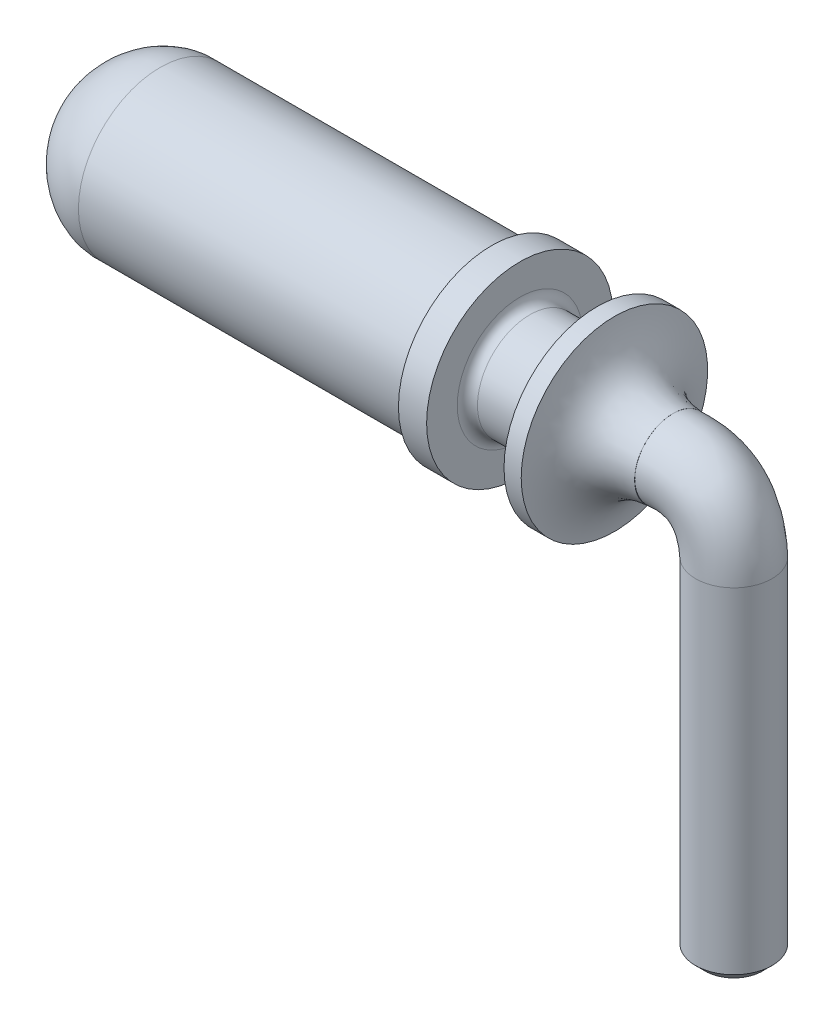
ISO-10303-21;
HEADER;
FILE_DESCRIPTION(('STEP AP214'),'2;1');
FILE_NAME('part.step','',(''),(''),'','','');
FILE_SCHEMA(('AUTOMOTIVE_DESIGN { 1 0 10303 214 1 1 1 1 }'));
ENDSEC;
DATA;
#1=APPLICATION_CONTEXT('core data for automotive mechanical design processes');
#2=APPLICATION_PROTOCOL_DEFINITION('international standard','automotive_design',2000,#1);
#3=PRODUCT_CONTEXT('',#1,'mechanical');
#4=PRODUCT('Part','Part','',(#3));
#5=PRODUCT_RELATED_PRODUCT_CATEGORY('part','',(#4));
#6=PRODUCT_DEFINITION_FORMATION('','',#4);
#7=PRODUCT_DEFINITION_CONTEXT('part definition',#1,'design');
#8=PRODUCT_DEFINITION('design','',#6,#7);
#9=PRODUCT_DEFINITION_SHAPE('','',#8);
#10=(LENGTH_UNIT() NAMED_UNIT(*) SI_UNIT(.MILLI.,.METRE.));
#11=(NAMED_UNIT(*) PLANE_ANGLE_UNIT() SI_UNIT($,.RADIAN.));
#12=(NAMED_UNIT(*) SI_UNIT($,.STERADIAN.) SOLID_ANGLE_UNIT());
#13=UNCERTAINTY_MEASURE_WITH_UNIT(LENGTH_MEASURE(1.E-05),#10,'distance_accuracy_value','');
#14=(GEOMETRIC_REPRESENTATION_CONTEXT(3) GLOBAL_UNCERTAINTY_ASSIGNED_CONTEXT((#13)) GLOBAL_UNIT_ASSIGNED_CONTEXT((#10,
#11,#12)) REPRESENTATION_CONTEXT('',''));
#15=CARTESIAN_POINT('',(0.,0.,0.));
#16=DIRECTION('',(0.,0.,1.));
#17=DIRECTION('',(1.,0.,0.));
#18=AXIS2_PLACEMENT_3D('',#15,#16,#17);
#19=CARTESIAN_POINT('',(2.86119939530297,6.27299782225298,0.));
#20=CARTESIAN_POINT('',(2.21093282068954,6.32097911556599,0.));
#21=CARTESIAN_POINT('',(1.56884413774031,5.64746855811936,0.));
#22=CARTESIAN_POINT('',(1.6260955307852,4.98680180097318,0.));
#23=B_SPLINE_CURVE_WITH_KNOTS('',3,(#19,#20,#21,#22),.UNSPECIFIED.,.F.,.F.,(4,4),(0.,1.),.UNSPECIFIED.);
#24=CARTESIAN_POINT('',(1.6260955307852,4.98680180097318,0.));
#25=DIRECTION('',(-1.,0.,0.));
#26=AXIS1_PLACEMENT('',#24,#25);
#27=SURFACE_OF_REVOLUTION('',#23,#26);
#28=CARTESIAN_POINT('',(1.6260955307852,4.98680180097318,0.));
#29=VERTEX_POINT('',#28);
#30=VERTEX_LOOP('',#29);
#31=FACE_BOUND('',#30,.T.);
#32=CARTESIAN_POINT('',(2.86119939530297,4.98680180097318,0.));
#33=DIRECTION('',(-1.,0.,0.));
#34=DIRECTION('',(0.,0.,1.));
#35=AXIS2_PLACEMENT_3D('',#32,#33,#34);
#36=CIRCLE('',#35,1.2861960212798);
#37=CARTESIAN_POINT('',(2.86119939530297,4.98680180097318,1.2861960212798));
#38=VERTEX_POINT('',#37);
#39=EDGE_CURVE('E68',#38,#38,#36,.T.);
#40=ORIENTED_EDGE('',*,*,#39,.T.);
#41=EDGE_LOOP('',(#40));
#42=FACE_BOUND('',#41,.T.);
#43=ADVANCED_FACE('F35',(#31,#42),#27,.T.);
#44=CARTESIAN_POINT('',(10.9215359798611,4.98680180097318,0.));
#45=DIRECTION('',(-1.,0.,0.));
#46=DIRECTION('',(0.,0.,1.));
#47=AXIS2_PLACEMENT_3D('',#44,#45,#46);
#48=PLANE('',#47);
#49=CARTESIAN_POINT('',(10.9215359798611,4.98680180097318,-0.599999999999998));
#50=CARTESIAN_POINT('',(10.9215359798611,5.00631371218067,-0.600000905869509));
#51=CARTESIAN_POINT('',(10.9215359798611,5.02581653306096,-0.599051764193004));
#52=CARTESIAN_POINT('',(10.9215359798611,5.06467222482705,-0.595265325416979));
#53=CARTESIAN_POINT('',(10.9215359798611,5.0840247762994,-0.592424750528807));
#54=CARTESIAN_POINT('',(10.9215359798611,5.13636618451657,-0.582111519608839));
#55=CARTESIAN_POINT('',(10.9215359798611,5.1690060027675,-0.572771501023492));
#56=CARTESIAN_POINT('',(10.9215359798611,5.23226235983946,-0.548738850973711));
#57=CARTESIAN_POINT('',(10.9215359798611,5.26287746167061,-0.534042465125776));
#58=CARTESIAN_POINT('',(10.9215359798611,5.32118497669962,-0.49972151329402));
#59=CARTESIAN_POINT('',(10.9215359798611,5.34887933441963,-0.48010025589777));
#60=CARTESIAN_POINT('',(10.9215359798611,5.40057342304137,-0.436479640056266));
#61=CARTESIAN_POINT('',(10.9215359798611,5.42457311448244,-0.41248023485645));
#62=CARTESIAN_POINT('',(10.9215359798611,5.46815652028505,-0.360826938809497));
#63=CARTESIAN_POINT('',(10.9215359798611,5.48774733552331,-0.333179039798175));
#64=CARTESIAN_POINT('',(10.9215359798611,5.52200251702507,-0.274983661465857));
#65=CARTESIAN_POINT('',(10.9215359798611,5.53666694358756,-0.244436217641155));
#66=CARTESIAN_POINT('',(10.9215359798611,5.56063586439295,-0.181348133850697));
#67=CARTESIAN_POINT('',(10.9215359798611,5.56994673516577,-0.148809916409271));
#68=CARTESIAN_POINT('',(10.9215359798611,5.58296982055429,-0.0826313042567923));
#69=CARTESIAN_POINT('',(10.9215359798611,5.58668198471284,-0.0489908996153061));
#70=CARTESIAN_POINT('',(10.9215359798611,5.58840085854777,0.0184137341530029));
#71=CARTESIAN_POINT('',(10.9215359798611,5.58641121572194,0.0521778703254224));
#72=CARTESIAN_POINT('',(10.9215359798611,5.57679122882931,0.118892107442368));
#73=CARTESIAN_POINT('',(10.9215359798611,5.56916099235123,0.151842223901121));
#74=CARTESIAN_POINT('',(10.9215359798611,5.54847839155734,0.21599163772166));
#75=CARTESIAN_POINT('',(10.9215359798611,5.53542641694818,0.247191060737829));
#76=CARTESIAN_POINT('',(10.9215359798611,5.5042719061192,0.30695829594544));
#77=CARTESIAN_POINT('',(10.9215359798611,5.48616921119512,0.335526025406006));
#78=CARTESIAN_POINT('',(10.9215359798611,5.44541885430269,0.38923390995087));
#79=CARTESIAN_POINT('',(10.9215359798611,5.42276892234223,0.414372342552922));
#80=CARTESIAN_POINT('',(10.9215359798611,5.37357371648668,0.460494581963287));
#81=CARTESIAN_POINT('',(10.9215359798611,5.34702845594151,0.481478403009545));
#82=CARTESIAN_POINT('',(10.9215359798611,5.29076477418325,0.518723333364575));
#83=CARTESIAN_POINT('',(10.9215359798611,5.26104249246329,0.534978605556111));
#84=CARTESIAN_POINT('',(10.9215359798611,5.19929416118594,0.562273330219152));
#85=CARTESIAN_POINT('',(10.9215359798611,5.16726881648412,0.57331437075122));
#86=CARTESIAN_POINT('',(10.9215359798611,5.11042203115056,0.587704533384412));
#87=CARTESIAN_POINT('',(10.9215359798611,5.08591074422,0.592310883306045));
#88=CARTESIAN_POINT('',(10.9215359798611,5.03653659897539,0.598459729874815));
#89=CARTESIAN_POINT('',(10.9215359798611,5.01167419336,0.600005863141146));
#90=CARTESIAN_POINT('',(10.9215359798611,4.98680180097318,0.599999999999998));
#91=B_SPLINE_CURVE_WITH_KNOTS('',3,(#49,#50,#51,#52,#53,#54,#55,#56,#57,#58,#59,#60,#61,#62,#63,
#64,#65,#66,#67,#68,#69,#70,#71,#72,#73,#74,#75,#76,#77,#78,#79,#80,#81,#82,#83,#84,#85,#86,#87,
#88,#89,#90),.UNSPECIFIED.,.F.,.F.,(4,2,2,2,2,2,2,2,2,2,2,2,2,2,2,2,2,2,2,2,4),(0.,
0.0584946893065879,0.117091012638487,0.218424807154772,0.319829765552225,0.42116678037985,
0.52250487745626,0.623678573717659,0.72485103156805,0.825902733642615,0.926955346418444,
1.02794332935205,1.12892938609006,1.22990818535276,1.33089015793924,1.43192266689122,
1.53295482959655,1.63411118642889,1.73523671490604,1.80987549999495,1.88442553444043),.UNSPECIFIED.);
#92=CARTESIAN_POINT('',(10.9215359798611,4.98680180097318,-0.599999999999998));
#93=VERTEX_POINT('',#92);
#94=CARTESIAN_POINT('',(10.9215359798611,4.98680180097318,0.599999999999998));
#95=VERTEX_POINT('',#94);
#96=EDGE_CURVE('E49',#93,#95,#91,.T.);
#97=ORIENTED_EDGE('',*,*,#96,.F.);
#98=DIRECTION('',(0.,0.,1.));
#99=VECTOR('',#98,1.);
#100=CARTESIAN_POINT('',(10.9215359798611,4.98680180097318,0.));
#101=LINE('',#100,#99);
#102=EDGE_CURVE('E55',#93,#95,#101,.T.);
#103=ORIENTED_EDGE('',*,*,#102,.T.);
#104=EDGE_LOOP('',(#97,#103));
#105=FACE_BOUND('',#104,.T.);
#106=CARTESIAN_POINT('',(10.9215359798611,4.98680180097318,0.));
#107=DIRECTION('',(-1.,0.,0.));
#108=DIRECTION('',(0.,0.,1.));
#109=AXIS2_PLACEMENT_3D('',#106,#107,#108);
#110=CIRCLE('',#109,0.602034634420137);
#111=CARTESIAN_POINT('',(10.9215359798611,4.98680180097318,0.602034634420137));
#112=VERTEX_POINT('',#111);
#113=EDGE_CURVE('E65',#112,#112,#110,.T.);
#114=ORIENTED_EDGE('',*,*,#113,.F.);
#115=EDGE_LOOP('',(#114));
#116=FACE_BOUND('',#115,.T.);
#117=ADVANCED_FACE('F56',(#105,#116),#48,.F.);
#118=CARTESIAN_POINT('',(10.9215359798611,5.58883643539332,0.));
#119=CARTESIAN_POINT('',(10.1135709093461,5.6374308046932,0.));
#120=CARTESIAN_POINT('',(10.0024188102123,6.45263104893288,0.));
#121=B_SPLINE_CURVE_WITH_KNOTS('',2,(#118,#119,#120),.UNSPECIFIED.,.F.,.F.,(3,3),(0.,1.),.UNSPECIFIED.);
#122=CARTESIAN_POINT('',(1.6260955307852,4.98680180097318,0.));
#123=DIRECTION('',(-1.,0.,0.));
#124=AXIS1_PLACEMENT('',#122,#123);
#125=SURFACE_OF_REVOLUTION('',#121,#124);
#126=CARTESIAN_POINT('',(10.0024188102123,4.98680180097318,0.));
#127=DIRECTION('',(-1.,0.,0.));
#128=DIRECTION('',(0.,0.,1.));
#129=AXIS2_PLACEMENT_3D('',#126,#127,#128);
#130=CIRCLE('',#129,1.4658292479597);
#131=CARTESIAN_POINT('',(10.0024188102123,4.98680180097318,1.4658292479597));
#132=VERTEX_POINT('',#131);
#133=EDGE_CURVE('E160',#132,#132,#130,.T.);
#134=ORIENTED_EDGE('',*,*,#133,.F.);
#135=EDGE_LOOP('',(#134));
#136=FACE_BOUND('',#135,.T.);
#137=ORIENTED_EDGE('',*,*,#113,.T.);
#138=EDGE_LOOP('',(#137));
#139=FACE_BOUND('',#138,.T.);
#140=ADVANCED_FACE('F92',(#136,#139),#125,.T.);
#141=CARTESIAN_POINT('',(1.6260955307852,4.98680180097318,0.));
#142=DIRECTION('',(-1.,0.,0.));
#143=DIRECTION('',(0.,0.,1.));
#144=AXIS2_PLACEMENT_3D('',#141,#142,#143);
#145=CYLINDRICAL_SURFACE('',#144,1.4658292479597);
#146=CARTESIAN_POINT('',(9.73201916607045,4.98680180097318,0.));
#147=DIRECTION('',(-1.,0.,0.));
#148=DIRECTION('',(0.,0.,1.));
#149=AXIS2_PLACEMENT_3D('',#146,#147,#148);
#150=CIRCLE('',#149,1.4658292479597);
#151=CARTESIAN_POINT('',(9.73201916607045,4.98680180097318,1.4658292479597));
#152=VERTEX_POINT('',#151);
#153=EDGE_CURVE('E157',#152,#152,#150,.T.);
#154=ORIENTED_EDGE('',*,*,#153,.F.);
#155=EDGE_LOOP('',(#154));
#156=FACE_BOUND('',#155,.T.);
#157=ORIENTED_EDGE('',*,*,#133,.T.);
#158=EDGE_LOOP('',(#157));
#159=FACE_BOUND('',#158,.T.);
#160=ADVANCED_FACE('F146',(#156,#159),#145,.T.);
#161=CARTESIAN_POINT('',(9.73201916607046,5.95885778571729,0.));
#162=DIRECTION('',(1.,0.,0.));
#163=DIRECTION('',(0.,0.,-1.));
#164=AXIS2_PLACEMENT_3D('',#161,#162,#163);
#165=PLANE('',#164);
#166=CARTESIAN_POINT('',(9.73201916607045,4.98680180097318,0.));
#167=DIRECTION('',(-1.,0.,0.));
#168=DIRECTION('',(0.,0.,1.));
#169=AXIS2_PLACEMENT_3D('',#166,#167,#168);
#170=CIRCLE('',#169,0.972055984744113);
#171=CARTESIAN_POINT('',(9.73201916607045,4.98680180097318,0.972055984744113));
#172=VERTEX_POINT('',#171);
#173=EDGE_CURVE('E162',#172,#172,#170,.T.);
#174=ORIENTED_EDGE('',*,*,#173,.F.);
#175=EDGE_LOOP('',(#174));
#176=FACE_BOUND('',#175,.T.);
#177=ORIENTED_EDGE('',*,*,#153,.T.);
#178=EDGE_LOOP('',(#177));
#179=FACE_BOUND('',#178,.T.);
#180=ADVANCED_FACE('F143',(#176,#179),#165,.F.);
#181=CARTESIAN_POINT('',(9.58506283773248,4.98680180097318,0.));
#182=DIRECTION('',(-1.,0.,0.));
#183=DIRECTION('',(0.,0.,1.));
#184=AXIS2_PLACEMENT_3D('',#181,#182,#183);
#185=TOROIDAL_SURFACE('',#184,0.972055984744113,0.146956328337972);
#186=CARTESIAN_POINT('',(9.58506283773248,4.98680180097318,0.));
#187=DIRECTION('',(-1.,0.,0.));
#188=DIRECTION('',(0.,0.,1.));
#189=AXIS2_PLACEMENT_3D('',#186,#187,#188);
#190=CIRCLE('',#189,0.825099656406141);
#191=CARTESIAN_POINT('',(9.58506283773248,4.98680180097318,0.825099656406141));
#192=VERTEX_POINT('',#191);
#193=EDGE_CURVE('E167',#192,#192,#190,.T.);
#194=ORIENTED_EDGE('',*,*,#193,.F.);
#195=EDGE_LOOP('',(#194));
#196=FACE_BOUND('',#195,.T.);
#197=ORIENTED_EDGE('',*,*,#173,.T.);
#198=EDGE_LOOP('',(#197));
#199=FACE_BOUND('',#198,.T.);
#200=ADVANCED_FACE('F139',(#196,#199),#185,.F.);
#201=CARTESIAN_POINT('',(1.6260955307852,4.98680180097318,0.));
#202=DIRECTION('',(-1.,0.,0.));
#203=DIRECTION('',(0.,0.,1.));
#204=AXIS2_PLACEMENT_3D('',#201,#202,#203);
#205=CYLINDRICAL_SURFACE('',#204,0.825099656406141);
#206=CARTESIAN_POINT('',(8.67393360203706,4.98680180097318,0.));
#207=DIRECTION('',(-1.,0.,0.));
#208=DIRECTION('',(0.,0.,1.));
#209=AXIS2_PLACEMENT_3D('',#206,#207,#208);
#210=CIRCLE('',#209,0.825099656406141);
#211=CARTESIAN_POINT('',(8.67393360203706,4.98680180097318,0.825099656406141));
#212=VERTEX_POINT('',#211);
#213=EDGE_CURVE('E170',#212,#212,#210,.T.);
#214=ORIENTED_EDGE('',*,*,#213,.F.);
#215=EDGE_LOOP('',(#214));
#216=FACE_BOUND('',#215,.T.);
#217=ORIENTED_EDGE('',*,*,#193,.T.);
#218=EDGE_LOOP('',(#217));
#219=FACE_BOUND('',#218,.T.);
#220=ADVANCED_FACE('F135',(#216,#219),#205,.T.);
#221=CARTESIAN_POINT('',(8.67393360203706,4.98680180097318,0.));
#222=DIRECTION('',(-1.,0.,0.));
#223=DIRECTION('',(0.,0.,1.));
#224=AXIS2_PLACEMENT_3D('',#221,#222,#223);
#225=TOROIDAL_SURFACE('',#224,0.983812491011151,0.158712834605009);
#226=CARTESIAN_POINT('',(8.51522076743205,4.98680180097318,0.));
#227=DIRECTION('',(-1.,0.,0.));
#228=DIRECTION('',(0.,0.,1.));
#229=AXIS2_PLACEMENT_3D('',#226,#227,#228);
#230=CIRCLE('',#229,0.983812491011151);
#231=CARTESIAN_POINT('',(8.51522076743205,4.98680180097318,0.983812491011151));
#232=VERTEX_POINT('',#231);
#233=EDGE_CURVE('E173',#232,#232,#230,.T.);
#234=ORIENTED_EDGE('',*,*,#233,.F.);
#235=EDGE_LOOP('',(#234));
#236=FACE_BOUND('',#235,.T.);
#237=ORIENTED_EDGE('',*,*,#213,.T.);
#238=EDGE_LOOP('',(#237));
#239=FACE_BOUND('',#238,.T.);
#240=ADVANCED_FACE('F131',(#236,#239),#225,.F.);
#241=CARTESIAN_POINT('',(8.51522076743205,6.45263104893288,0.));
#242=DIRECTION('',(-1.,0.,0.));
#243=DIRECTION('',(0.,0.,1.));
#244=AXIS2_PLACEMENT_3D('',#241,#242,#243);
#245=PLANE('',#244);
#246=CARTESIAN_POINT('',(8.51522076743205,4.98680180097318,0.));
#247=DIRECTION('',(-1.,0.,0.));
#248=DIRECTION('',(0.,0.,1.));
#249=AXIS2_PLACEMENT_3D('',#246,#247,#248);
#250=CIRCLE('',#249,1.4658292479597);
#251=CARTESIAN_POINT('',(8.51522076743205,4.98680180097318,1.4658292479597));
#252=VERTEX_POINT('',#251);
#253=EDGE_CURVE('E176',#252,#252,#250,.T.);
#254=ORIENTED_EDGE('',*,*,#253,.F.);
#255=EDGE_LOOP('',(#254));
#256=FACE_BOUND('',#255,.T.);
#257=ORIENTED_EDGE('',*,*,#233,.T.);
#258=EDGE_LOOP('',(#257));
#259=FACE_BOUND('',#258,.T.);
#260=ADVANCED_FACE('F127',(#256,#259),#245,.F.);
#261=CARTESIAN_POINT('',(1.6260955307852,4.98680180097318,0.));
#262=DIRECTION('',(-1.,0.,0.));
#263=DIRECTION('',(0.,0.,1.));
#264=AXIS2_PLACEMENT_3D('',#261,#262,#263);
#265=CYLINDRICAL_SURFACE('',#264,1.4658292479597);
#266=CARTESIAN_POINT('',(8.07212794410563,4.98680180097318,0.));
#267=DIRECTION('',(-1.,0.,0.));
#268=DIRECTION('',(0.,0.,1.));
#269=AXIS2_PLACEMENT_3D('',#266,#267,#268);
#270=CIRCLE('',#269,1.4658292479597);
#271=CARTESIAN_POINT('',(8.07212794410563,4.98680180097318,1.4658292479597));
#272=VERTEX_POINT('',#271);
#273=EDGE_CURVE('E179',#272,#272,#270,.T.);
#274=ORIENTED_EDGE('',*,*,#273,.F.);
#275=EDGE_LOOP('',(#274));
#276=FACE_BOUND('',#275,.T.);
#277=ORIENTED_EDGE('',*,*,#253,.T.);
#278=EDGE_LOOP('',(#277));
#279=FACE_BOUND('',#278,.T.);
#280=ADVANCED_FACE('F123',(#276,#279),#265,.T.);
#281=CARTESIAN_POINT('',(8.07212794410563,6.27299782225298,0.));
#282=DIRECTION('',(1.,0.,0.));
#283=DIRECTION('',(0.,0.,-1.));
#284=AXIS2_PLACEMENT_3D('',#281,#282,#283);
#285=PLANE('',#284);
#286=CARTESIAN_POINT('',(8.07212794410563,4.98680180097318,0.));
#287=DIRECTION('',(-1.,0.,0.));
#288=DIRECTION('',(0.,0.,1.));
#289=AXIS2_PLACEMENT_3D('',#286,#287,#288);
#290=CIRCLE('',#289,1.2861960212798);
#291=CARTESIAN_POINT('',(8.07212794410563,4.98680180097318,1.2861960212798));
#292=VERTEX_POINT('',#291);
#293=EDGE_CURVE('E72',#292,#292,#290,.T.);
#294=ORIENTED_EDGE('',*,*,#293,.F.);
#295=EDGE_LOOP('',(#294));
#296=FACE_BOUND('',#295,.T.);
#297=ORIENTED_EDGE('',*,*,#273,.T.);
#298=EDGE_LOOP('',(#297));
#299=FACE_BOUND('',#298,.T.);
#300=ADVANCED_FACE('F119',(#296,#299),#285,.F.);
#301=CARTESIAN_POINT('',(1.6260955307852,4.98680180097318,0.));
#302=DIRECTION('',(-1.,0.,0.));
#303=DIRECTION('',(0.,0.,1.));
#304=AXIS2_PLACEMENT_3D('',#301,#302,#303);
#305=CYLINDRICAL_SURFACE('',#304,1.2861960212798);
#306=ORIENTED_EDGE('',*,*,#39,.F.);
#307=EDGE_LOOP('',(#306));
#308=FACE_BOUND('',#307,.T.);
#309=ORIENTED_EDGE('',*,*,#293,.T.);
#310=EDGE_LOOP('',(#309));
#311=FACE_BOUND('',#310,.T.);
#312=ADVANCED_FACE('F116',(#308,#311),#305,.T.);
#313=CARTESIAN_POINT('',(10.9215359798611,4.98680180097318,0.));
#314=DIRECTION('',(-0.999596108052815,-0.0284186693155418,0.));
#315=DIRECTION('',(0.,0.,1.));
#316=AXIS2_PLACEMENT_3D('',#313,#314,#315);
#317=PLANE('',#316);
#318=ORIENTED_EDGE('',*,*,#102,.F.);
#319=CARTESIAN_POINT('',(10.9215359798611,4.98680180097318,0.));
#320=DIRECTION('',(-0.999596108052815,-0.0284186693155418,0.));
#321=DIRECTION('',(0.,0.,1.));
#322=AXIS2_PLACEMENT_3D('',#319,#320,#321);
#323=CIRCLE('',#322,0.599999999999998);
#324=EDGE_CURVE('E64',#93,#95,#323,.T.);
#325=ORIENTED_EDGE('',*,*,#324,.T.);
#326=EDGE_LOOP('',(#318,#325));
#327=FACE_BOUND('',#326,.T.);
#328=ADVANCED_FACE('F67',(#327),#317,.T.);
#329=CARTESIAN_POINT('',(10.9215359798611,4.98680180097318,0.599999999999998));
#330=CARTESIAN_POINT('',(11.0716624561603,5.00005437457384,0.599999999999998));
#331=CARTESIAN_POINT('',(11.2042022318007,4.99189851440335,0.599999999999998));
#332=CARTESIAN_POINT('',(11.4341083817625,4.93276992651886,0.599999999999998));
#333=CARTESIAN_POINT('',(11.5314747560843,4.88179719880474,0.599999999999998));
#334=CARTESIAN_POINT('',(11.691034103409,4.73703487583363,0.599999999999998));
#335=CARTESIAN_POINT('',(11.7532270764121,4.64324528057648,0.599999999999998));
#336=CARTESIAN_POINT('',(11.8424396211002,4.41284922251837,0.599999999999998));
#337=CARTESIAN_POINT('',(11.869459192785,4.27624275971792,0.599999999999998));
#338=CARTESIAN_POINT('',(11.8788920638102,4.11822786314582,0.599999999999998));
#339=CARTESIAN_POINT('',(10.8874335766825,6.18631713063656,0.599999999999998));
#340=CARTESIAN_POINT('',(11.1425086335712,6.20255347791401,0.599999999999998));
#341=CARTESIAN_POINT('',(11.4106898602917,6.18605743404688,0.599999999999998));
#342=CARTESIAN_POINT('',(11.9628590303154,6.02321702892148,0.599999999999998));
#343=CARTESIAN_POINT('',(12.2456139200967,5.86781959106953,0.599999999999998));
#344=CARTESIAN_POINT('',(12.6925839525849,5.42922915909817,0.599999999999998));
#345=CARTESIAN_POINT('',(12.8484535976618,5.15792851613917,0.599999999999998));
#346=CARTESIAN_POINT('',(13.0329526264156,4.62987277023583,0.599999999999998));
#347=CARTESIAN_POINT('',(13.0694592444438,4.37141204600451,0.599999999999998));
#348=CARTESIAN_POINT('',(13.0788920638102,4.11822786314582,0.599999999999998));
#349=CARTESIAN_POINT('',(10.8874335766825,6.18631713063656,-0.599999999999998));
#350=CARTESIAN_POINT('',(11.1425086335712,6.20255347791401,-0.599999999999998));
#351=CARTESIAN_POINT('',(11.4106898602917,6.18605743404688,-0.599999999999998));
#352=CARTESIAN_POINT('',(11.9628590303154,6.02321702892148,-0.599999999999998));
#353=CARTESIAN_POINT('',(12.2456139200967,5.86781959106953,-0.599999999999998));
#354=CARTESIAN_POINT('',(12.6925839525849,5.42922915909817,-0.599999999999998));
#355=CARTESIAN_POINT('',(12.8484535976618,5.15792851613917,-0.599999999999998));
#356=CARTESIAN_POINT('',(13.0329526264156,4.62987277023583,-0.599999999999998));
#357=CARTESIAN_POINT('',(13.0694592444438,4.37141204600451,-0.599999999999998));
#358=CARTESIAN_POINT('',(13.0788920638102,4.11822786314582,-0.599999999999998));
#359=CARTESIAN_POINT('',(10.9215359798611,4.98680180097318,-0.599999999999998));
#360=CARTESIAN_POINT('',(11.0716624561603,5.00005437457384,-0.599999999999998));
#361=CARTESIAN_POINT('',(11.2042022318007,4.99189851440335,-0.599999999999998));
#362=CARTESIAN_POINT('',(11.4341083817625,4.93276992651886,-0.599999999999998));
#363=CARTESIAN_POINT('',(11.5314747560843,4.88179719880474,-0.599999999999998));
#364=CARTESIAN_POINT('',(11.691034103409,4.73703487583363,-0.599999999999998));
#365=CARTESIAN_POINT('',(11.7532270764121,4.64324528057648,-0.599999999999998));
#366=CARTESIAN_POINT('',(11.8424396211002,4.41284922251837,-0.599999999999998));
#367=CARTESIAN_POINT('',(11.869459192785,4.27624275971792,-0.599999999999998));
#368=CARTESIAN_POINT('',(11.8788920638102,4.11822786314582,-0.599999999999998));
#369=CARTESIAN_POINT('',(10.9556383830398,3.78728647130981,-0.599999999999998));
#370=CARTESIAN_POINT('',(11.0008162787495,3.79755527123367,-0.599999999999998));
#371=CARTESIAN_POINT('',(10.9977146033098,3.79773959475982,-0.599999999999998));
#372=CARTESIAN_POINT('',(10.9053577332096,3.84232282411624,-0.599999999999998));
#373=CARTESIAN_POINT('',(10.8173355920719,3.89577480653995,-0.599999999999998));
#374=CARTESIAN_POINT('',(10.689484254233,4.04484059256909,-0.599999999999998));
#375=CARTESIAN_POINT('',(10.6580005551624,4.12856204501379,-0.599999999999998));
#376=CARTESIAN_POINT('',(10.6519266157849,4.1958256748009,-0.599999999999998));
#377=CARTESIAN_POINT('',(10.6694591411262,4.18107347343134,-0.599999999999998));
#378=CARTESIAN_POINT('',(10.6788920638103,4.11822786314582,-0.599999999999998));
#379=CARTESIAN_POINT('',(10.9556383830398,3.78728647130981,0.599999999999998));
#380=CARTESIAN_POINT('',(11.0008162787495,3.79755527123367,0.599999999999998));
#381=CARTESIAN_POINT('',(10.9977146033098,3.79773959475982,0.599999999999998));
#382=CARTESIAN_POINT('',(10.9053577332096,3.84232282411624,0.599999999999998));
#383=CARTESIAN_POINT('',(10.8173355920719,3.89577480653995,0.599999999999998));
#384=CARTESIAN_POINT('',(10.689484254233,4.04484059256909,0.599999999999998));
#385=CARTESIAN_POINT('',(10.6580005551624,4.12856204501379,0.599999999999998));
#386=CARTESIAN_POINT('',(10.6519266157849,4.1958256748009,0.599999999999998));
#387=CARTESIAN_POINT('',(10.6694591411262,4.18107347343134,0.599999999999998));
#388=CARTESIAN_POINT('',(10.6788920638103,4.11822786314582,0.599999999999998));
#389=CARTESIAN_POINT('',(10.9215359798611,4.98680180097318,0.599999999999998));
#390=CARTESIAN_POINT('',(11.0716624561603,5.00005437457384,0.599999999999998));
#391=CARTESIAN_POINT('',(11.2042022318007,4.99189851440335,0.599999999999998));
#392=CARTESIAN_POINT('',(11.4341083817625,4.93276992651886,0.599999999999998));
#393=CARTESIAN_POINT('',(11.5314747560843,4.88179719880474,0.599999999999998));
#394=CARTESIAN_POINT('',(11.691034103409,4.73703487583363,0.599999999999998));
#395=CARTESIAN_POINT('',(11.7532270764121,4.64324528057648,0.599999999999998));
#396=CARTESIAN_POINT('',(11.8424396211002,4.41284922251837,0.599999999999998));
#397=CARTESIAN_POINT('',(11.869459192785,4.27624275971792,0.599999999999998));
#398=CARTESIAN_POINT('',(11.8788920638102,4.11822786314582,0.599999999999998));
#399=(BOUNDED_SURFACE() B_SPLINE_SURFACE(3,3,((#329,#330,#331,#332,#333,#334,#335,#336,#337,
#338),(#339,#340,#341,#342,#343,#344,#345,#346,#347,#348),(#349,#350,#351,#352,#353,#354,#355,
#356,#357,#358),(#359,#360,#361,#362,#363,#364,#365,#366,#367,#368),(#369,#370,#371,#372,#373,
#374,#375,#376,#377,#378),(#379,#380,#381,#382,#383,#384,#385,#386,#387,#388),(#389,#390,#391,
#392,#393,#394,#395,#396,#397,#398)),.UNSPECIFIED.,.T.,.F.,.F.) B_SPLINE_SURFACE_WITH_KNOTS((4,
3,4),(4,2,2,2,4),(0.,0.5,1.),(0.,0.25,0.5,0.75,1.),
.UNSPECIFIED.) GEOMETRIC_REPRESENTATION_ITEM() RATIONAL_B_SPLINE_SURFACE(((1.,1.,1.,1.,1.,1.,1.,
1.,1.,1.),(0.333333333333333,0.333333333333333,0.333333333333333,0.333333333333333,
0.333333333333333,0.333333333333333,0.333333333333333,0.333333333333333,0.333333333333333,
0.333333333333333),(0.333333333333333,0.333333333333333,0.333333333333333,0.333333333333333,
0.333333333333333,0.333333333333333,0.333333333333333,0.333333333333333,0.333333333333333,
0.333333333333333),(1.,1.,1.,1.,1.,1.,1.,1.,1.,1.),(0.333333333333333,0.333333333333333,
0.333333333333333,0.333333333333333,0.333333333333333,0.333333333333333,0.333333333333333,
0.333333333333333,0.333333333333333,0.333333333333333),(0.333333333333333,0.333333333333333,
0.333333333333333,0.333333333333333,0.333333333333333,0.333333333333333,0.333333333333333,
0.333333333333333,0.333333333333333,0.333333333333333),(1.,1.,1.,1.,1.,1.,1.,1.,1.,1.))) REPRESENTATION_ITEM('') SURFACE());
#400=CARTESIAN_POINT('',(11.8788920638102,4.11822786314582,0.));
#401=DIRECTION('',(0.,1.,0.));
#402=DIRECTION('',(0.,0.,1.));
#403=AXIS2_PLACEMENT_3D('',#400,#401,#402);
#404=CIRCLE('',#403,0.599999999999998);
#405=CARTESIAN_POINT('',(11.8788920638102,4.11822786314582,0.599999999999998));
#406=VERTEX_POINT('',#405);
#407=EDGE_CURVE('E69',#406,#406,#404,.T.);
#408=ORIENTED_EDGE('',*,*,#407,.T.);
#409=EDGE_LOOP('',(#408));
#410=FACE_BOUND('',#409,.T.);
#411=ORIENTED_EDGE('',*,*,#324,.F.);
#412=ORIENTED_EDGE('',*,*,#96,.T.);
#413=EDGE_LOOP('',(#411,#412));
#414=FACE_BOUND('',#413,.T.);
#415=ADVANCED_FACE('F63',(#410,#414),#399,.F.);
#416=CARTESIAN_POINT('',(0.,-1.3,0.));
#417=DIRECTION('',(0.,-1.,0.));
#418=DIRECTION('',(0.,0.,-1.));
#419=AXIS2_PLACEMENT_3D('',#416,#417,#418);
#420=PLANE('',#419);
#421=CARTESIAN_POINT('',(11.8788920638102,-1.3,0.));
#422=DIRECTION('',(0.,-1.,0.));
#423=DIRECTION('',(0.,0.,-1.));
#424=AXIS2_PLACEMENT_3D('',#421,#422,#423);
#425=CIRCLE('',#424,0.449999999999997);
#426=CARTESIAN_POINT('',(11.8788920638102,-1.3,-0.449999999999997));
#427=VERTEX_POINT('',#426);
#428=EDGE_CURVE('E11',#427,#427,#425,.T.);
#429=ORIENTED_EDGE('',*,*,#428,.T.);
#430=EDGE_LOOP('',(#429));
#431=FACE_BOUND('',#430,.T.);
#432=ADVANCED_FACE('F106',(#431),#420,.T.);
#433=CARTESIAN_POINT('',(11.8788920638102,4.11822786314582,0.));
#434=DIRECTION('',(0.,1.,0.));
#435=DIRECTION('',(0.,0.,1.));
#436=AXIS2_PLACEMENT_3D('',#433,#434,#435);
#437=CYLINDRICAL_SURFACE('',#436,0.599999999999998);
#438=CARTESIAN_POINT('',(11.8788920638102,-1.15,0.));
#439=DIRECTION('',(0.,-1.,0.));
#440=DIRECTION('',(0.,0.,-1.));
#441=AXIS2_PLACEMENT_3D('',#438,#439,#440);
#442=CIRCLE('',#441,0.599999999999998);
#443=CARTESIAN_POINT('',(11.8788920638102,-1.15,-0.599999999999998));
#444=VERTEX_POINT('',#443);
#445=EDGE_CURVE('E43',#444,#444,#442,.F.);
#446=ORIENTED_EDGE('',*,*,#445,.T.);
#447=EDGE_LOOP('',(#446));
#448=FACE_BOUND('',#447,.T.);
#449=ORIENTED_EDGE('',*,*,#407,.F.);
#450=EDGE_LOOP('',(#449));
#451=FACE_BOUND('',#450,.T.);
#452=ADVANCED_FACE('F269',(#448,#451),#437,.T.);
#453=CARTESIAN_POINT('',(11.8788920638102,-1.15,0.));
#454=DIRECTION('',(0.,1.,0.));
#455=DIRECTION('',(0.,0.,1.));
#456=AXIS2_PLACEMENT_3D('',#453,#454,#455);
#457=CONICAL_SURFACE('',#456,0.599999999999998,0.785398163397445);
#458=ORIENTED_EDGE('',*,*,#428,.F.);
#459=EDGE_LOOP('',(#458));
#460=FACE_BOUND('',#459,.T.);
#461=ORIENTED_EDGE('',*,*,#445,.F.);
#462=EDGE_LOOP('',(#461));
#463=FACE_BOUND('',#462,.T.);
#464=ADVANCED_FACE('F37',(#460,#463),#457,.T.);
#465=CLOSED_SHELL('',(#43,#117,#140,#160,#180,#200,#220,#240,#260,#280,#300,#312,#328,#415,#432,
#452,#464));
#466=MANIFOLD_SOLID_BREP('B2',#465);
#467=ADVANCED_BREP_SHAPE_REPRESENTATION('',(#18,#466),#14);
#468=SHAPE_DEFINITION_REPRESENTATION(#9,#467);
ENDSEC;
END-ISO-10303-21;
